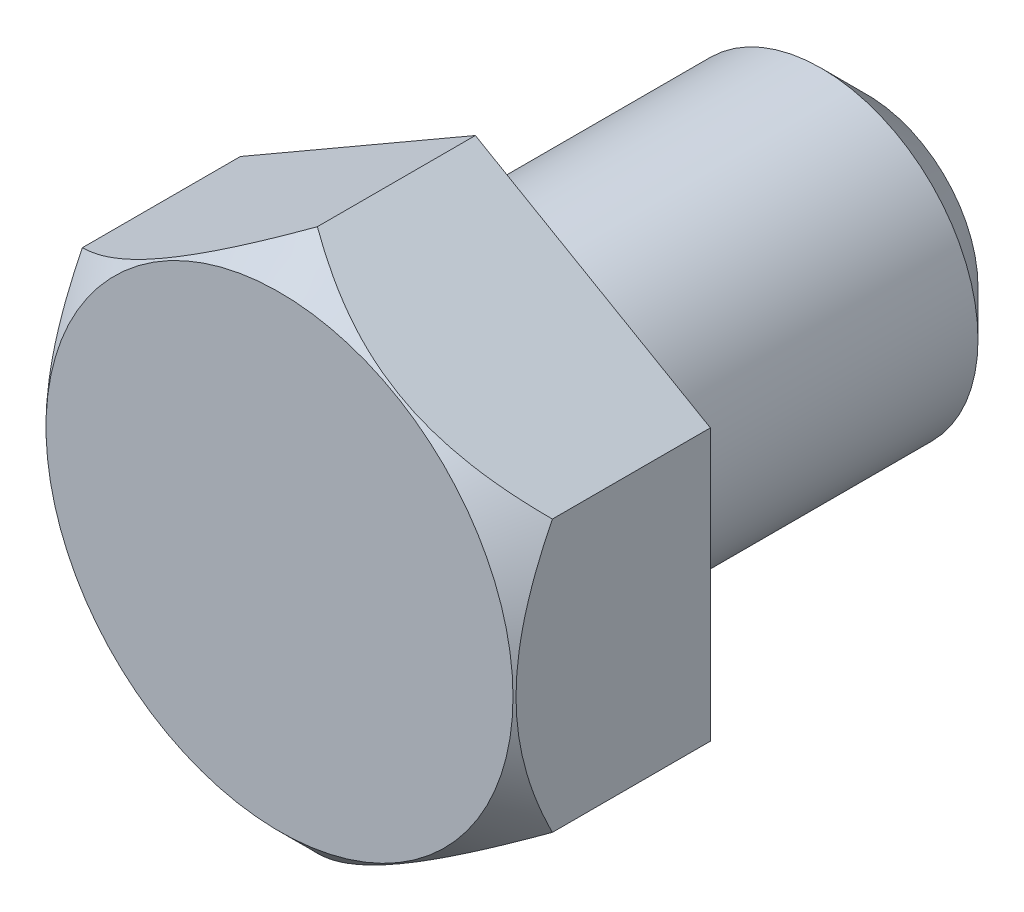
ISO-10303-21;
HEADER;
FILE_DESCRIPTION(('STEP AP214'),'2;1');
FILE_NAME('part.step','',(''),(''),'','','');
FILE_SCHEMA(('AUTOMOTIVE_DESIGN { 1 0 10303 214 1 1 1 1 }'));
ENDSEC;
DATA;
#1=APPLICATION_CONTEXT('core data for automotive mechanical design processes');
#2=APPLICATION_PROTOCOL_DEFINITION('international standard','automotive_design',2000,#1);
#3=PRODUCT_CONTEXT('',#1,'mechanical');
#4=PRODUCT('Part','Part','',(#3));
#5=PRODUCT_RELATED_PRODUCT_CATEGORY('part','',(#4));
#6=PRODUCT_DEFINITION_FORMATION('','',#4);
#7=PRODUCT_DEFINITION_CONTEXT('part definition',#1,'design');
#8=PRODUCT_DEFINITION('design','',#6,#7);
#9=PRODUCT_DEFINITION_SHAPE('','',#8);
#10=(LENGTH_UNIT() NAMED_UNIT(*) SI_UNIT(.MILLI.,.METRE.));
#11=(NAMED_UNIT(*) PLANE_ANGLE_UNIT() SI_UNIT($,.RADIAN.));
#12=(NAMED_UNIT(*) SI_UNIT($,.STERADIAN.) SOLID_ANGLE_UNIT());
#13=UNCERTAINTY_MEASURE_WITH_UNIT(LENGTH_MEASURE(1.E-05),#10,'distance_accuracy_value','');
#14=(GEOMETRIC_REPRESENTATION_CONTEXT(3) GLOBAL_UNCERTAINTY_ASSIGNED_CONTEXT((#13)) GLOBAL_UNIT_ASSIGNED_CONTEXT((#10,
#11,#12)) REPRESENTATION_CONTEXT('',''));
#15=CARTESIAN_POINT('',(0.,0.,0.));
#16=DIRECTION('',(0.,0.,1.));
#17=DIRECTION('',(1.,0.,0.));
#18=AXIS2_PLACEMENT_3D('',#15,#16,#17);
#19=CARTESIAN_POINT('',(8.99999999999999,5.19615242270663,7.5));
#20=DIRECTION('',(-0.5,-0.866025403784439,0.));
#21=DIRECTION('',(0.866025403784439,-0.5,0.));
#22=AXIS2_PLACEMENT_3D('',#19,#20,#21);
#23=PLANE('',#22);
#24=CARTESIAN_POINT('',(9.00019999999999,5.1960369526528,6.04988452802168));
#25=CARTESIAN_POINT('',(8.84546874816844,5.28537108254979,6.1392062101696));
#26=CARTESIAN_POINT('',(8.68952569814364,5.37540484445986,6.22580229696819));
#27=CARTESIAN_POINT('',(8.37502737226237,5.5569805375671,6.3926774837665));
#28=CARTESIAN_POINT('',(8.21647072612613,5.64852325989566,6.47295313382824));
#29=CARTESIAN_POINT('',(7.89580870938962,5.83365756157737,6.62666162646683));
#30=CARTESIAN_POINT('',(7.73368821770892,5.92725787109038,6.70005265649951));
#31=CARTESIAN_POINT('',(7.40678444951671,6.11599584965525,6.83839791246839));
#32=CARTESIAN_POINT('',(7.2420015844558,6.21113328115601,6.90335342829141));
#33=CARTESIAN_POINT('',(6.91242253938659,6.40141583154598,7.02277243724327));
#34=CARTESIAN_POINT('',(6.74766686150013,6.49653756652424,7.0773841146058));
#35=CARTESIAN_POINT('',(6.41584590884674,6.68811448286144,7.17625356409885));
#36=CARTESIAN_POINT('',(6.24878088478457,6.7845695194759,7.22051245093257));
#37=CARTESIAN_POINT('',(5.91305583085258,6.97840046973724,7.29756204863293));
#38=CARTESIAN_POINT('',(5.74440028444977,7.07577379485322,7.33037857345809));
#39=CARTESIAN_POINT('',(5.40567326667778,7.27133792974568,7.38382234263472));
#40=CARTESIAN_POINT('',(5.23560201074898,7.36952861513759,7.4044514084681));
#41=CARTESIAN_POINT('',(4.82115385657945,7.60881036851251,7.43904046360949));
#42=CARTESIAN_POINT('',(4.57632899956654,7.75016006561323,7.44629902346818));
#43=CARTESIAN_POINT('',(4.08712205642764,8.03260382592391,7.43411615046054));
#44=CARTESIAN_POINT('',(3.84274015556695,8.1736977821709,7.41466535847223));
#45=CARTESIAN_POINT('',(3.35628001197074,8.45455567702619,7.35021187620419));
#46=CARTESIAN_POINT('',(3.11420465353323,8.59431795038427,7.30518061323979));
#47=CARTESIAN_POINT('',(2.63421474470633,8.87144025345378,7.19201394602376));
#48=CARTESIAN_POINT('',(2.39629987672358,9.00880046652784,7.12388031347175));
#49=CARTESIAN_POINT('',(1.97396754394334,9.25263415254599,6.98371177517318));
#50=CARTESIAN_POINT('',(1.78861473287835,9.35964764790942,6.91536391886469));
#51=CARTESIAN_POINT('',(1.42123625252264,9.57175371243726,6.76765467088125));
#52=CARTESIAN_POINT('',(1.23921068413348,9.67684622334614,6.6882929458261));
#53=CARTESIAN_POINT('',(0.879060016533277,9.88477930823394,6.52033483439851));
#54=CARTESIAN_POINT('',(0.700924674637261,9.98762579582979,6.43176748990212));
#55=CARTESIAN_POINT('',(0.34795239099676,10.1914144388061,6.2465608085583));
#56=CARTESIAN_POINT('',(0.173113506341721,10.2923577159265,6.14992642107076));
#57=CARTESIAN_POINT('',(-0.000200000000003341,10.3924203154671,6.04988452802168));
#58=B_SPLINE_CURVE_WITH_KNOTS('',3,(#24,#25,#26,#27,#28,#29,#30,#31,#32,#33,#34,#35,#36,#37,#38,
#39,#40,#41,#42,#43,#44,#45,#46,#47,#48,#49,#50,#51,#52,#53,#54,#55,#56,#57),.UNSPECIFIED.,.F.,
.F.,(4,2,2,2,2,2,2,2,2,2,2,2,2,2,2,2,4),(0.,0.599280235236766,1.19888534507658,1.80192368753476,
2.40486970967003,2.99838724231363,3.59184084043245,4.18394681111483,4.77596426594383,
5.62301971612228,6.47037205551889,7.31867273053728,8.16690836485972,8.8406179995192,
9.51434803123068,10.1860136281046,10.8572701257283),.UNSPECIFIED.);
#59=CARTESIAN_POINT('',(9.,5.19615242270664,6.05));
#60=VERTEX_POINT('',#59);
#61=CARTESIAN_POINT('',(0.,10.3923048454133,6.05));
#62=VERTEX_POINT('',#61);
#63=EDGE_CURVE('E83',#60,#62,#58,.T.);
#64=ORIENTED_EDGE('',*,*,#63,.F.);
#65=DIRECTION('',(0.,0.,-1.));
#66=VECTOR('',#65,1.);
#67=CARTESIAN_POINT('',(8.99999999999999,5.19615242270663,7.5));
#68=LINE('',#67,#66);
#69=CARTESIAN_POINT('',(8.99999999999999,5.19615242270663,0.));
#70=VERTEX_POINT('',#69);
#71=EDGE_CURVE('E52',#60,#70,#68,.T.);
#72=ORIENTED_EDGE('',*,*,#71,.T.);
#73=DIRECTION('',(-0.866025403784439,0.5,0.));
#74=VECTOR('',#73,1.);
#75=CARTESIAN_POINT('',(8.99999999999999,5.19615242270663,0.));
#76=LINE('',#75,#74);
#77=CARTESIAN_POINT('',(0.,10.3923048454133,0.));
#78=VERTEX_POINT('',#77);
#79=EDGE_CURVE('E91',#70,#78,#76,.T.);
#80=ORIENTED_EDGE('',*,*,#79,.T.);
#81=DIRECTION('',(0.,0.,-1.));
#82=VECTOR('',#81,1.);
#83=CARTESIAN_POINT('',(0.,10.3923048454133,7.5));
#84=LINE('',#83,#82);
#85=EDGE_CURVE('E90',#62,#78,#84,.T.);
#86=ORIENTED_EDGE('',*,*,#85,.F.);
#87=EDGE_LOOP('',(#64,#72,#80,#86));
#88=FACE_BOUND('',#87,.T.);
#89=ADVANCED_FACE('F29',(#88),#23,.F.);
#90=CARTESIAN_POINT('',(0.,10.3923048454133,7.5));
#91=DIRECTION('',(0.5,-0.866025403784439,0.));
#92=DIRECTION('',(0.866025403784439,0.5,0.));
#93=AXIS2_PLACEMENT_3D('',#90,#91,#92);
#94=PLANE('',#93);
#95=CARTESIAN_POINT('',(0.000199999999996665,10.3924203154671,6.04988452802168));
#96=CARTESIAN_POINT('',(-0.154531251831557,10.3030861855701,6.1392062101696));
#97=CARTESIAN_POINT('',(-0.310474301856361,10.21305242366,6.22580229696819));
#98=CARTESIAN_POINT('',(-0.624972627737624,10.0314767305528,6.3926774837665));
#99=CARTESIAN_POINT('',(-0.783529273873864,9.93993400822424,6.47295313382824));
#100=CARTESIAN_POINT('',(-1.10419129061038,9.75479970654252,6.62666162646683));
#101=CARTESIAN_POINT('',(-1.26631178229108,9.66119939702951,6.7000526564995));
#102=CARTESIAN_POINT('',(-1.59321555048329,9.47246141846464,6.83839791246839));
#103=CARTESIAN_POINT('',(-1.7579984155442,9.37732398696389,6.90335342829141));
#104=CARTESIAN_POINT('',(-2.08757746061341,9.18704143657392,7.02277243724327));
#105=CARTESIAN_POINT('',(-2.25233313849987,9.09191970159565,7.0773841146058));
#106=CARTESIAN_POINT('',(-2.58415409115326,8.90034278525845,7.17625356409885));
#107=CARTESIAN_POINT('',(-2.75121911521543,8.80388774864399,7.22051245093256));
#108=CARTESIAN_POINT('',(-3.08694416914742,8.61005679838265,7.29756204863293));
#109=CARTESIAN_POINT('',(-3.25559971555023,8.51268347326667,7.33037857345809));
#110=CARTESIAN_POINT('',(-3.59432673332222,8.31711933837421,7.38382234263472));
#111=CARTESIAN_POINT('',(-3.76439798925102,8.2189286529823,7.4044514084681));
#112=CARTESIAN_POINT('',(-4.17884614342055,7.97964689960738,7.43904046360949));
#113=CARTESIAN_POINT('',(-4.42367100043347,7.83829720250666,7.44629902346818));
#114=CARTESIAN_POINT('',(-4.91287794357236,7.55585344219598,7.43411615046054));
#115=CARTESIAN_POINT('',(-5.15725984443305,7.41475948594899,7.41466535847223));
#116=CARTESIAN_POINT('',(-5.64371998802927,7.1339015910937,7.35021187620419));
#117=CARTESIAN_POINT('',(-5.88579534646678,6.99413931773562,7.30518061323979));
#118=CARTESIAN_POINT('',(-6.36578525529367,6.71701701466611,7.19201394602375));
#119=CARTESIAN_POINT('',(-6.60370012327643,6.57965680159205,7.12388031347175));
#120=CARTESIAN_POINT('',(-7.02603245605666,6.3358231155739,6.98371177517318));
#121=CARTESIAN_POINT('',(-7.21138526712166,6.22880962021047,6.91536391886469));
#122=CARTESIAN_POINT('',(-7.57876374747736,6.01670355568263,6.76765467088124));
#123=CARTESIAN_POINT('',(-7.76078931586653,5.91161104477375,6.6882929458261));
#124=CARTESIAN_POINT('',(-8.12093998346672,5.70367795988596,6.5203348343985));
#125=CARTESIAN_POINT('',(-8.29907532536274,5.60083147229011,6.43176748990212));
#126=CARTESIAN_POINT('',(-8.65204760900324,5.39704282931379,6.24656080855829));
#127=CARTESIAN_POINT('',(-8.82688649365828,5.29609955219339,6.14992642107076));
#128=CARTESIAN_POINT('',(-9.0002,5.19603695265279,6.04988452802168));
#129=B_SPLINE_CURVE_WITH_KNOTS('',3,(#95,#96,#97,#98,#99,#100,#101,#102,#103,#104,#105,#106,
#107,#108,#109,#110,#111,#112,#113,#114,#115,#116,#117,#118,#119,#120,#121,#122,#123,#124,#125,
#126,#127,#128),.UNSPECIFIED.,.F.,.F.,(4,2,2,2,2,2,2,2,2,2,2,2,2,2,2,2,4),(0.,0.599280235236767,
1.19888534507658,1.80192368753476,2.40486970967003,2.99838724231364,3.59184084043245,
4.18394681111483,4.77596426594383,5.62301971612229,6.47037205551889,7.31867273053728,
8.16690836485972,8.84061799951921,9.51434803123069,10.1860136281046,10.8572701257283),.UNSPECIFIED.);
#130=CARTESIAN_POINT('',(-9.,5.19615242270663,6.05));
#131=VERTEX_POINT('',#130);
#132=EDGE_CURVE('E92',#62,#131,#129,.T.);
#133=ORIENTED_EDGE('',*,*,#132,.F.);
#134=ORIENTED_EDGE('',*,*,#85,.T.);
#135=DIRECTION('',(-0.866025403784439,-0.5,0.));
#136=VECTOR('',#135,1.);
#137=CARTESIAN_POINT('',(0.,10.3923048454133,0.));
#138=LINE('',#137,#136);
#139=CARTESIAN_POINT('',(-9.,5.19615242270663,0.));
#140=VERTEX_POINT('',#139);
#141=EDGE_CURVE('E251',#78,#140,#138,.T.);
#142=ORIENTED_EDGE('',*,*,#141,.T.);
#143=DIRECTION('',(0.,0.,-1.));
#144=VECTOR('',#143,1.);
#145=CARTESIAN_POINT('',(-9.,5.19615242270663,7.5));
#146=LINE('',#145,#144);
#147=EDGE_CURVE('E109',#131,#140,#146,.T.);
#148=ORIENTED_EDGE('',*,*,#147,.F.);
#149=EDGE_LOOP('',(#133,#134,#142,#148));
#150=FACE_BOUND('',#149,.T.);
#151=ADVANCED_FACE('F133',(#150),#94,.F.);
#152=CARTESIAN_POINT('',(-9.,5.19615242270663,7.5));
#153=DIRECTION('',(1.,0.,0.));
#154=DIRECTION('',(0.,1.,0.));
#155=AXIS2_PLACEMENT_3D('',#152,#153,#154);
#156=PLANE('',#155);
#157=CARTESIAN_POINT('',(-9.,-10.8206656543603,2.36797341534342));
#158=CARTESIAN_POINT('',(-9.,-10.5591534710426,2.56898474466377));
#159=CARTESIAN_POINT('',(-9.,-10.2962295695414,2.76818836388469));
#160=CARTESIAN_POINT('',(-9.,-9.7669822628075,3.16215508197963));
#161=CARTESIAN_POINT('',(-9.,-9.50065806581457,3.35691711608966));
#162=CARTESIAN_POINT('',(-9.,-8.9620876195428,3.74256164209066));
#163=CARTESIAN_POINT('',(-9.,-8.68981152995522,3.93340259709294));
#164=CARTESIAN_POINT('',(-9.,-8.1407233432396,4.30842104769678));
#165=CARTESIAN_POINT('',(-9.,-7.86391156070987,4.49259900262918));
#166=CARTESIAN_POINT('',(-9.,-7.28735573629986,4.86413966383312));
#167=CARTESIAN_POINT('',(-9.,-6.98726686055188,5.05096994440507));
#168=CARTESIAN_POINT('',(-9.,-6.38004353426591,5.41300221801002));
#169=CARTESIAN_POINT('',(-9.,-6.07290791290248,5.58820225955952));
#170=CARTESIAN_POINT('',(-9.,-5.45151243654742,5.92324051978842));
#171=CARTESIAN_POINT('',(-9.,-5.13727709054008,6.08312383977347));
#172=CARTESIAN_POINT('',(-9.,-4.49993772744527,6.38394659183207));
#173=CARTESIAN_POINT('',(-9.,-4.17683797323645,6.52489494386541));
#174=CARTESIAN_POINT('',(-9.,-3.55315889495205,6.77012650715317));
#175=CARTESIAN_POINT('',(-9.,-3.25346858122324,6.87664766899407));
#176=CARTESIAN_POINT('',(-9.,-2.6464726253964,7.06569958635688));
#177=CARTESIAN_POINT('',(-9.,-2.3391664978883,7.14822880841162));
#178=CARTESIAN_POINT('',(-9.,-1.72411454919937,7.28346199865793));
#179=CARTESIAN_POINT('',(-9.,-1.41648953083334,7.33670617022749));
#180=CARTESIAN_POINT('',(-9.,-0.79744290002866,7.41226190656771));
#181=CARTESIAN_POINT('',(-9.,-0.486022081625765,7.43457983239523));
#182=CARTESIAN_POINT('',(-9.,0.123944713404887,7.44639353800857));
#183=CARTESIAN_POINT('',(-9.,0.42246423905943,7.43726878667557));
#184=CARTESIAN_POINT('',(-9.,1.01716333454385,7.38986246610543));
#185=CARTESIAN_POINT('',(-9.,1.31334268857592,7.35157823892694));
#186=CARTESIAN_POINT('',(-9.,1.90623664847018,7.24736327720784));
#187=CARTESIAN_POINT('',(-9.,2.20286415027568,7.18094530028799));
#188=CARTESIAN_POINT('',(-9.,2.78959060648163,7.02414072277436));
#189=CARTESIAN_POINT('',(-9.,3.07968993932876,6.93375551549637));
#190=CARTESIAN_POINT('',(-9.,3.66979925953434,6.72703186627928));
#191=CARTESIAN_POINT('',(-9.,3.9693765062085,6.60947204277634));
#192=CARTESIAN_POINT('',(-9.,4.56082238260966,6.35619457779586));
#193=CARTESIAN_POINT('',(-9.,4.85268745988634,6.22046873727902));
#194=CARTESIAN_POINT('',(-9.,5.43008930597691,5.93407830599356));
#195=CARTESIAN_POINT('',(-9.,5.71560304653794,5.7833676637493));
#196=CARTESIAN_POINT('',(-9.,6.28008700978101,5.47032480378405));
#197=CARTESIAN_POINT('',(-9.,6.55905823258745,5.30799437790296));
#198=CARTESIAN_POINT('',(-9.,7.09767494879576,4.98223014221199));
#199=CARTESIAN_POINT('',(-9.,7.35759439092468,4.81924688452906));
#200=CARTESIAN_POINT('',(-9.,7.87296777358696,4.48634620591854));
#201=CARTESIAN_POINT('',(-9.,8.12842137710196,4.31642826485808));
#202=CARTESIAN_POINT('',(-9.,8.6333927523989,3.9722790900151));
#203=CARTESIAN_POINT('',(-9.,8.88294172234709,3.7980934688641));
#204=CARTESIAN_POINT('',(-9.,9.37861668026239,3.44505536137082));
#205=CARTESIAN_POINT('',(-9.,9.62474359280476,3.26620417467312));
#206=CARTESIAN_POINT('',(-9.,9.8694351057001,3.08544333884572));
#207=B_SPLINE_CURVE_WITH_KNOTS('',3,(#157,#158,#159,#160,#161,#162,#163,#164,#165,#166,#167,
#168,#169,#170,#171,#172,#173,#174,#175,#176,#177,#178,#179,#180,#181,#182,#183,#184,#185,#186,
#187,#188,#189,#190,#191,#192,#193,#194,#195,#196,#197,#198,#199,#200,#201,#202,#203,#204,#205,
#206),.UNSPECIFIED.,.F.,.F.,(4,2,2,2,2,2,2,2,2,2,2,2,2,2,2,2,2,2,2,2,2,2,2,2,4),(0.,
0.989537088057374,1.97930895205032,2.97671888198217,3.97405992139084,5.03433610005736,
6.09478973926846,7.15201807932918,8.20874661640774,9.16209824831975,10.115510801199,
11.0506899914377,11.9856768010206,12.8801752427891,13.7747552295407,14.6855060926938,
15.5962040216756,16.5609179021838,17.5260686736697,18.4942830546041,19.4623484514246,
20.3825970494356,21.3029147975965,22.2158397246058,23.1285130061524),.UNSPECIFIED.);
#208=CARTESIAN_POINT('',(-8.99999999999999,-5.19615242270663,6.05));
#209=VERTEX_POINT('',#208);
#210=EDGE_CURVE('E154',#131,#209,#207,.F.);
#211=ORIENTED_EDGE('',*,*,#210,.F.);
#212=ORIENTED_EDGE('',*,*,#147,.T.);
#213=DIRECTION('',(0.,-1.,0.));
#214=VECTOR('',#213,1.);
#215=CARTESIAN_POINT('',(-9.,5.19615242270663,0.));
#216=LINE('',#215,#214);
#217=CARTESIAN_POINT('',(-9.,-5.19615242270663,0.));
#218=VERTEX_POINT('',#217);
#219=EDGE_CURVE('E252',#140,#218,#216,.T.);
#220=ORIENTED_EDGE('',*,*,#219,.T.);
#221=DIRECTION('',(0.,0.,-1.));
#222=VECTOR('',#221,1.);
#223=CARTESIAN_POINT('',(-9.,-5.19615242270663,7.5));
#224=LINE('',#223,#222);
#225=EDGE_CURVE('E107',#209,#218,#224,.T.);
#226=ORIENTED_EDGE('',*,*,#225,.F.);
#227=EDGE_LOOP('',(#211,#212,#220,#226));
#228=FACE_BOUND('',#227,.T.);
#229=ADVANCED_FACE('F138',(#228),#156,.F.);
#230=CARTESIAN_POINT('',(-9.,-5.19615242270663,7.5));
#231=DIRECTION('',(0.5,0.866025403784439,0.));
#232=DIRECTION('',(-0.866025403784439,0.5,0.));
#233=AXIS2_PLACEMENT_3D('',#230,#231,#232);
#234=PLANE('',#233);
#235=CARTESIAN_POINT('',(-9.0002,-5.1960369526528,6.04988452802168));
#236=CARTESIAN_POINT('',(-8.84546874816844,-5.28537108254979,6.13920621016959));
#237=CARTESIAN_POINT('',(-8.68952569814364,-5.37540484445986,6.22580229696819));
#238=CARTESIAN_POINT('',(-8.37502737226237,-5.5569805375671,6.3926774837665));
#239=CARTESIAN_POINT('',(-8.21647072612614,-5.64852325989566,6.47295313382824));
#240=CARTESIAN_POINT('',(-7.89580870938962,-5.83365756157738,6.62666162646683));
#241=CARTESIAN_POINT('',(-7.73368821770892,-5.92725787109038,6.7000526564995));
#242=CARTESIAN_POINT('',(-7.40678444951671,-6.11599584965526,6.83839791246839));
#243=CARTESIAN_POINT('',(-7.2420015844558,-6.21113328115601,6.90335342829141));
#244=CARTESIAN_POINT('',(-6.91242253938659,-6.40141583154598,7.02277243724327));
#245=CARTESIAN_POINT('',(-6.74766686150013,-6.49653756652425,7.0773841146058));
#246=CARTESIAN_POINT('',(-6.41584590884673,-6.68811448286144,7.17625356409885));
#247=CARTESIAN_POINT('',(-6.24878088478457,-6.78456951947591,7.22051245093257));
#248=CARTESIAN_POINT('',(-5.91305583085258,-6.97840046973724,7.29756204863293));
#249=CARTESIAN_POINT('',(-5.74440028444977,-7.07577379485323,7.33037857345809));
#250=CARTESIAN_POINT('',(-5.40567326667778,-7.27133792974569,7.38382234263472));
#251=CARTESIAN_POINT('',(-5.23560201074898,-7.36952861513759,7.4044514084681));
#252=CARTESIAN_POINT('',(-4.82115385657945,-7.60881036851252,7.43904046360949));
#253=CARTESIAN_POINT('',(-4.57632899956654,-7.75016006561323,7.44629902346818));
#254=CARTESIAN_POINT('',(-4.08712205642764,-8.03260382592391,7.43411615046054));
#255=CARTESIAN_POINT('',(-3.84274015556695,-8.1736977821709,7.41466535847223));
#256=CARTESIAN_POINT('',(-3.35628001197074,-8.4545556770262,7.35021187620419));
#257=CARTESIAN_POINT('',(-3.11420465353323,-8.59431795038427,7.30518061323979));
#258=CARTESIAN_POINT('',(-2.63421474470633,-8.87144025345378,7.19201394602376));
#259=CARTESIAN_POINT('',(-2.39629987672357,-9.00880046652784,7.12388031347175));
#260=CARTESIAN_POINT('',(-1.97396754394334,-9.25263415254599,6.98371177517318));
#261=CARTESIAN_POINT('',(-1.78861473287834,-9.35964764790942,6.91536391886469));
#262=CARTESIAN_POINT('',(-1.42123625252264,-9.57175371243726,6.76765467088124));
#263=CARTESIAN_POINT('',(-1.23921068413347,-9.67684622334614,6.6882929458261));
#264=CARTESIAN_POINT('',(-0.879060016533275,-9.88477930823394,6.5203348343985));
#265=CARTESIAN_POINT('',(-0.70092467463726,-9.98762579582979,6.43176748990212));
#266=CARTESIAN_POINT('',(-0.34795239099676,-10.1914144388061,6.24656080855829));
#267=CARTESIAN_POINT('',(-0.173113506341723,-10.2923577159265,6.14992642107076));
#268=CARTESIAN_POINT('',(0.000200000000002587,-10.3924203154671,6.04988452802168));
#269=B_SPLINE_CURVE_WITH_KNOTS('',3,(#235,#236,#237,#238,#239,#240,#241,#242,#243,#244,#245,
#246,#247,#248,#249,#250,#251,#252,#253,#254,#255,#256,#257,#258,#259,#260,#261,#262,#263,#264,
#265,#266,#267,#268),.UNSPECIFIED.,.F.,.F.,(4,2,2,2,2,2,2,2,2,2,2,2,2,2,2,2,4),(0.,
0.599280235236769,1.19888534507659,1.80192368753476,2.40486970967003,2.99838724231364,
3.59184084043245,4.18394681111483,4.77596426594383,5.62301971612229,6.47037205551889,
7.31867273053728,8.16690836485972,8.84061799951921,9.51434803123069,10.1860136281046,
10.8572701257283),.UNSPECIFIED.);
#270=CARTESIAN_POINT('',(0.,-10.3923048454133,6.05));
#271=VERTEX_POINT('',#270);
#272=EDGE_CURVE('E183',#209,#271,#269,.T.);
#273=ORIENTED_EDGE('',*,*,#272,.F.);
#274=ORIENTED_EDGE('',*,*,#225,.T.);
#275=DIRECTION('',(0.866025403784439,-0.5,0.));
#276=VECTOR('',#275,1.);
#277=CARTESIAN_POINT('',(-9.,-5.19615242270663,0.));
#278=LINE('',#277,#276);
#279=CARTESIAN_POINT('',(0.,-10.3923048454133,0.));
#280=VERTEX_POINT('',#279);
#281=EDGE_CURVE('E257',#218,#280,#278,.T.);
#282=ORIENTED_EDGE('',*,*,#281,.T.);
#283=DIRECTION('',(0.,0.,-1.));
#284=VECTOR('',#283,1.);
#285=CARTESIAN_POINT('',(0.,-10.3923048454133,7.5));
#286=LINE('',#285,#284);
#287=EDGE_CURVE('E100',#271,#280,#286,.T.);
#288=ORIENTED_EDGE('',*,*,#287,.F.);
#289=EDGE_LOOP('',(#273,#274,#282,#288));
#290=FACE_BOUND('',#289,.T.);
#291=ADVANCED_FACE('F143',(#290),#234,.F.);
#292=CARTESIAN_POINT('',(0.,-10.3923048454133,7.5));
#293=DIRECTION('',(-0.5,0.866025403784439,0.));
#294=DIRECTION('',(-0.866025403784439,-0.5,0.));
#295=AXIS2_PLACEMENT_3D('',#292,#293,#294);
#296=PLANE('',#295);
#297=CARTESIAN_POINT('',(-0.000199999999998163,-10.3924203154671,6.04988452802168));
#298=CARTESIAN_POINT('',(0.154531251831556,-10.3030861855701,6.13920621016959));
#299=CARTESIAN_POINT('',(0.31047430185636,-10.21305242366,6.22580229696819));
#300=CARTESIAN_POINT('',(0.624972627737622,-10.0314767305528,6.3926774837665));
#301=CARTESIAN_POINT('',(0.783529273873862,-9.93993400822424,6.47295313382824));
#302=CARTESIAN_POINT('',(1.10419129061038,-9.75479970654252,6.62666162646683));
#303=CARTESIAN_POINT('',(1.26631178229108,-9.66119939702951,6.7000526564995));
#304=CARTESIAN_POINT('',(1.59321555048329,-9.47246141846464,6.83839791246838));
#305=CARTESIAN_POINT('',(1.7579984155442,-9.37732398696389,6.90335342829141));
#306=CARTESIAN_POINT('',(2.08757746061341,-9.18704143657392,7.02277243724326));
#307=CARTESIAN_POINT('',(2.25233313849987,-9.09191970159565,7.0773841146058));
#308=CARTESIAN_POINT('',(2.58415409115326,-8.90034278525845,7.17625356409885));
#309=CARTESIAN_POINT('',(2.75121911521543,-8.80388774864399,7.22051245093256));
#310=CARTESIAN_POINT('',(3.08694416914742,-8.61005679838265,7.29756204863292));
#311=CARTESIAN_POINT('',(3.25559971555023,-8.51268347326667,7.33037857345809));
#312=CARTESIAN_POINT('',(3.59432673332222,-8.31711933837421,7.38382234263472));
#313=CARTESIAN_POINT('',(3.76439798925102,-8.2189286529823,7.4044514084681));
#314=CARTESIAN_POINT('',(4.17884614342055,-7.97964689960738,7.43904046360949));
#315=CARTESIAN_POINT('',(4.42367100043346,-7.83829720250666,7.44629902346818));
#316=CARTESIAN_POINT('',(4.91287794357236,-7.55585344219599,7.43411615046054));
#317=CARTESIAN_POINT('',(5.15725984443305,-7.414759485949,7.41466535847223));
#318=CARTESIAN_POINT('',(5.64371998802926,-7.1339015910937,7.35021187620419));
#319=CARTESIAN_POINT('',(5.88579534646678,-6.99413931773563,7.30518061323979));
#320=CARTESIAN_POINT('',(6.36578525529367,-6.71701701466611,7.19201394602376));
#321=CARTESIAN_POINT('',(6.60370012327643,-6.57965680159205,7.12388031347175));
#322=CARTESIAN_POINT('',(7.02603245605666,-6.3358231155739,6.98371177517318));
#323=CARTESIAN_POINT('',(7.21138526712166,-6.22880962021047,6.91536391886469));
#324=CARTESIAN_POINT('',(7.57876374747736,-6.01670355568263,6.76765467088124));
#325=CARTESIAN_POINT('',(7.76078931586653,-5.91161104477375,6.6882929458261));
#326=CARTESIAN_POINT('',(8.12093998346672,-5.70367795988596,6.5203348343985));
#327=CARTESIAN_POINT('',(8.29907532536274,-5.6008314722901,6.43176748990212));
#328=CARTESIAN_POINT('',(8.65204760900324,-5.39704282931379,6.24656080855829));
#329=CARTESIAN_POINT('',(8.82688649365828,-5.29609955219339,6.14992642107076));
#330=CARTESIAN_POINT('',(9.0002,-5.19603695265279,6.04988452802168));
#331=B_SPLINE_CURVE_WITH_KNOTS('',3,(#297,#298,#299,#300,#301,#302,#303,#304,#305,#306,#307,
#308,#309,#310,#311,#312,#313,#314,#315,#316,#317,#318,#319,#320,#321,#322,#323,#324,#325,#326,
#327,#328,#329,#330),.UNSPECIFIED.,.F.,.F.,(4,2,2,2,2,2,2,2,2,2,2,2,2,2,2,2,4),(0.,
0.599280235236768,1.19888534507658,1.80192368753476,2.40486970967003,2.99838724231364,
3.59184084043245,4.18394681111483,4.77596426594384,5.62301971612229,6.47037205551889,
7.31867273053728,8.16690836485972,8.84061799951921,9.51434803123069,10.1860136281046,
10.8572701257283),.UNSPECIFIED.);
#332=CARTESIAN_POINT('',(9.,-5.19615242270663,6.05));
#333=VERTEX_POINT('',#332);
#334=EDGE_CURVE('E44',#271,#333,#331,.T.);
#335=ORIENTED_EDGE('',*,*,#334,.F.);
#336=ORIENTED_EDGE('',*,*,#287,.T.);
#337=DIRECTION('',(0.866025403784439,0.5,0.));
#338=VECTOR('',#337,1.);
#339=CARTESIAN_POINT('',(0.,-10.3923048454133,0.));
#340=LINE('',#339,#338);
#341=CARTESIAN_POINT('',(9.,-5.19615242270663,0.));
#342=VERTEX_POINT('',#341);
#343=EDGE_CURVE('E102',#280,#342,#340,.T.);
#344=ORIENTED_EDGE('',*,*,#343,.T.);
#345=DIRECTION('',(0.,0.,-1.));
#346=VECTOR('',#345,1.);
#347=CARTESIAN_POINT('',(9.,-5.19615242270663,7.5));
#348=LINE('',#347,#346);
#349=EDGE_CURVE('E98',#333,#342,#348,.T.);
#350=ORIENTED_EDGE('',*,*,#349,.F.);
#351=EDGE_LOOP('',(#335,#336,#344,#350));
#352=FACE_BOUND('',#351,.T.);
#353=ADVANCED_FACE('F189',(#352),#296,.F.);
#354=CARTESIAN_POINT('',(9.,-5.19615242270663,7.5));
#355=DIRECTION('',(-1.,0.,0.));
#356=DIRECTION('',(0.,-1.,0.));
#357=AXIS2_PLACEMENT_3D('',#354,#355,#356);
#358=PLANE('',#357);
#359=CARTESIAN_POINT('',(9.,-10.8206656543629,2.36797341534139));
#360=CARTESIAN_POINT('',(9.,-10.5591534710451,2.56898474466182));
#361=CARTESIAN_POINT('',(9.,-10.2962295695438,2.76818836388282));
#362=CARTESIAN_POINT('',(9.,-9.76698226280982,3.16215508197792));
#363=CARTESIAN_POINT('',(9.,-9.50065806581682,3.35691711608802));
#364=CARTESIAN_POINT('',(9.,-8.96208761954489,3.74256164208918));
#365=CARTESIAN_POINT('',(9.,-8.68981152995723,3.93340259709154));
#366=CARTESIAN_POINT('',(9.,-8.14072334324145,4.30842104769554));
#367=CARTESIAN_POINT('',(9.,-7.86391156071164,4.49259900262801));
#368=CARTESIAN_POINT('',(9.,-7.28735573630145,4.86413966383211));
#369=CARTESIAN_POINT('',(9.,-6.98726686055338,5.05096994440415));
#370=CARTESIAN_POINT('',(9.,-6.38004353426722,5.41300221800926));
#371=CARTESIAN_POINT('',(9.,-6.07290791290369,5.58820225955885));
#372=CARTESIAN_POINT('',(9.,-5.45151243654844,5.9232405197879));
#373=CARTESIAN_POINT('',(9.,-5.13727709054099,6.08312383977302));
#374=CARTESIAN_POINT('',(9.,-4.49993772744598,6.38394659183176));
#375=CARTESIAN_POINT('',(9.,-4.17683797323706,6.52489494386515));
#376=CARTESIAN_POINT('',(9.,-3.55315889495261,6.77012650715296));
#377=CARTESIAN_POINT('',(9.,-3.25346858122386,6.87664766899385));
#378=CARTESIAN_POINT('',(9.,-2.64647262539716,7.06569958635667));
#379=CARTESIAN_POINT('',(9.,-2.33916649788913,7.14822880841141));
#380=CARTESIAN_POINT('',(9.,-1.72411454920034,7.28346199865775));
#381=CARTESIAN_POINT('',(9.,-1.41648953083437,7.33670617022733));
#382=CARTESIAN_POINT('',(9.,-0.797442900029822,7.4122619065676));
#383=CARTESIAN_POINT('',(9.,-0.486022081626992,7.43457983239516));
#384=CARTESIAN_POINT('',(9.,0.123944713403551,7.44639353800859));
#385=CARTESIAN_POINT('',(9.,0.422464239058049,7.43726878667564));
#386=CARTESIAN_POINT('',(9.,1.01716333454239,7.3898624661056));
#387=CARTESIAN_POINT('',(9.,1.31334268857441,7.35157823892716));
#388=CARTESIAN_POINT('',(9.,1.90623664846859,7.24736327720817));
#389=CARTESIAN_POINT('',(9.,2.20286415027405,7.18094530028839));
#390=CARTESIAN_POINT('',(9.,2.78959060647992,7.02414072277487));
#391=CARTESIAN_POINT('',(9.,3.07968993932702,6.93375551549694));
#392=CARTESIAN_POINT('',(9.,3.66979925953239,6.72703186628002));
#393=CARTESIAN_POINT('',(8.99999999999999,3.96937650620639,6.6094720427772));
#394=CARTESIAN_POINT('',(8.99999999999999,4.56082238260723,6.35619457779696));
#395=CARTESIAN_POINT('',(8.99999999999999,4.85268745988375,6.22046873728025));
#396=CARTESIAN_POINT('',(8.99999999999999,5.43008930597401,5.93407830599506));
#397=CARTESIAN_POINT('',(8.99999999999999,5.71560304653489,5.78336766375094));
#398=CARTESIAN_POINT('',(8.99999999999999,6.28008700977766,5.47032480378597));
#399=CARTESIAN_POINT('',(8.99999999999999,6.55905823258396,5.30799437790502));
#400=CARTESIAN_POINT('',(8.99999999999999,7.097674948792,4.98223014221432));
#401=CARTESIAN_POINT('',(8.99999999999999,7.35759439092081,4.81924688453152));
#402=CARTESIAN_POINT('',(8.99999999999999,7.87296777358286,4.48634620592125));
#403=CARTESIAN_POINT('',(8.99999999999999,8.12842137709773,4.31642826486092));
#404=CARTESIAN_POINT('',(8.99999999999999,8.63339275239445,3.97227909001819));
#405=CARTESIAN_POINT('',(8.99999999999999,8.88294172234252,3.79809346886731));
#406=CARTESIAN_POINT('',(8.99999999999999,9.37861668025759,3.44505536137429));
#407=CARTESIAN_POINT('',(8.99999999999999,9.62474359279985,3.26620417467671));
#408=CARTESIAN_POINT('',(8.99999999999999,9.86943510569508,3.08544333884944));
#409=B_SPLINE_CURVE_WITH_KNOTS('',3,(#359,#360,#361,#362,#363,#364,#365,#366,#367,#368,#369,
#370,#371,#372,#373,#374,#375,#376,#377,#378,#379,#380,#381,#382,#383,#384,#385,#386,#387,#388,
#389,#390,#391,#392,#393,#394,#395,#396,#397,#398,#399,#400,#401,#402,#403,#404,#405,#406,#407,
#408),.UNSPECIFIED.,.F.,.F.,(4,2,2,2,2,2,2,2,2,2,2,2,2,2,2,2,2,2,2,2,2,2,2,2,4),(0.,
0.989537088057701,1.97930895205097,2.97671888198315,3.97405992139215,5.03433610005904,
6.09478973927051,7.1520180793316,8.20874661641052,9.16209824832234,10.1155108012014,
11.0506899914399,11.9856768010226,12.8801752427909,13.7747552295424,14.6855060926954,
15.596204021677,16.5609179021846,17.52606867367,18.4942830546038,19.4623484514237,
20.3825970494342,21.3029147975946,22.2158397246034,23.1285130061494),.UNSPECIFIED.);
#410=EDGE_CURVE('E81',#333,#60,#409,.T.);
#411=ORIENTED_EDGE('',*,*,#410,.F.);
#412=ORIENTED_EDGE('',*,*,#349,.T.);
#413=DIRECTION('',(0.,1.,0.));
#414=VECTOR('',#413,1.);
#415=CARTESIAN_POINT('',(9.,-5.19615242270663,0.));
#416=LINE('',#415,#414);
#417=EDGE_CURVE('E96',#342,#70,#416,.T.);
#418=ORIENTED_EDGE('',*,*,#417,.T.);
#419=ORIENTED_EDGE('',*,*,#71,.F.);
#420=EDGE_LOOP('',(#411,#412,#418,#419));
#421=FACE_BOUND('',#420,.T.);
#422=ADVANCED_FACE('F94',(#421),#358,.F.);
#423=CARTESIAN_POINT('',(-9.00000000000001,15.5884572681199,0.));
#424=DIRECTION('',(0.,0.,1.));
#425=DIRECTION('',(1.,0.,0.));
#426=AXIS2_PLACEMENT_3D('',#423,#424,#425);
#427=PLANE('',#426);
#428=ORIENTED_EDGE('',*,*,#79,.F.);
#429=ORIENTED_EDGE('',*,*,#417,.F.);
#430=ORIENTED_EDGE('',*,*,#343,.F.);
#431=ORIENTED_EDGE('',*,*,#281,.F.);
#432=ORIENTED_EDGE('',*,*,#219,.F.);
#433=ORIENTED_EDGE('',*,*,#141,.F.);
#434=EDGE_LOOP('',(#428,#429,#430,#431,#432,#433));
#435=FACE_BOUND('',#434,.T.);
#436=CARTESIAN_POINT('',(0.,0.,0.));
#437=DIRECTION('',(0.,0.,1.));
#438=DIRECTION('',(1.,0.,0.));
#439=AXIS2_PLACEMENT_3D('',#436,#437,#438);
#440=CIRCLE('',#439,6.);
#441=CARTESIAN_POINT('',(6.,0.,0.));
#442=VERTEX_POINT('',#441);
#443=EDGE_CURVE('E112',#442,#442,#440,.F.);
#444=ORIENTED_EDGE('',*,*,#443,.F.);
#445=EDGE_LOOP('',(#444));
#446=FACE_BOUND('',#445,.T.);
#447=ADVANCED_FACE('F196',(#435,#446),#427,.F.);
#448=CARTESIAN_POINT('',(0.,0.,-15.));
#449=DIRECTION('',(0.,0.,1.));
#450=DIRECTION('',(1.,0.,0.));
#451=AXIS2_PLACEMENT_3D('',#448,#449,#450);
#452=CYLINDRICAL_SURFACE('',#451,6.);
#453=CARTESIAN_POINT('',(0.,0.,-13.25));
#454=DIRECTION('',(0.,0.,-1.));
#455=DIRECTION('',(-1.,0.,0.));
#456=AXIS2_PLACEMENT_3D('',#453,#454,#455);
#457=CIRCLE('',#456,6.);
#458=CARTESIAN_POINT('',(6.,0.,-13.25));
#459=VERTEX_POINT('',#458);
#460=EDGE_CURVE('E11',#459,#459,#457,.F.);
#461=ORIENTED_EDGE('',*,*,#460,.T.);
#462=EDGE_LOOP('',(#461));
#463=FACE_BOUND('',#462,.T.);
#464=ORIENTED_EDGE('',*,*,#443,.T.);
#465=EDGE_LOOP('',(#464));
#466=FACE_BOUND('',#465,.T.);
#467=ADVANCED_FACE('F198',(#463,#466),#452,.T.);
#468=CARTESIAN_POINT('',(0.,0.,-15.));
#469=DIRECTION('',(0.,0.,-1.));
#470=DIRECTION('',(-1.,0.,0.));
#471=AXIS2_PLACEMENT_3D('',#468,#469,#470);
#472=PLANE('',#471);
#473=CARTESIAN_POINT('',(0.,0.,-15.));
#474=DIRECTION('',(0.,0.,-1.));
#475=DIRECTION('',(-1.,0.,0.));
#476=AXIS2_PLACEMENT_3D('',#473,#474,#475);
#477=CIRCLE('',#476,4.25);
#478=CARTESIAN_POINT('',(4.25,0.,-15.));
#479=VERTEX_POINT('',#478);
#480=EDGE_CURVE('E37',#479,#479,#477,.T.);
#481=ORIENTED_EDGE('',*,*,#480,.T.);
#482=EDGE_LOOP('',(#481));
#483=FACE_BOUND('',#482,.T.);
#484=ADVANCED_FACE('F117',(#483),#472,.T.);
#485=CARTESIAN_POINT('',(0.,0.,7.5));
#486=DIRECTION('',(0.,0.,-1.));
#487=DIRECTION('',(-1.,0.,0.));
#488=AXIS2_PLACEMENT_3D('',#485,#486,#487);
#489=CONICAL_SURFACE('',#488,8.94230484541326,0.785398163397448);
#490=CARTESIAN_POINT('',(0.,0.,7.5));
#491=DIRECTION('',(0.,0.,1.));
#492=DIRECTION('',(1.,0.,0.));
#493=AXIS2_PLACEMENT_3D('',#490,#491,#492);
#494=CIRCLE('',#493,8.94230484541326);
#495=CARTESIAN_POINT('',(8.94230484541326,0.,7.5));
#496=VERTEX_POINT('',#495);
#497=EDGE_CURVE('E87',#496,#496,#494,.T.);
#498=ORIENTED_EDGE('',*,*,#497,.F.);
#499=EDGE_LOOP('',(#498));
#500=FACE_BOUND('',#499,.T.);
#501=ORIENTED_EDGE('',*,*,#63,.T.);
#502=ORIENTED_EDGE('',*,*,#132,.T.);
#503=ORIENTED_EDGE('',*,*,#210,.T.);
#504=ORIENTED_EDGE('',*,*,#272,.T.);
#505=ORIENTED_EDGE('',*,*,#334,.T.);
#506=ORIENTED_EDGE('',*,*,#410,.T.);
#507=EDGE_LOOP('',(#501,#502,#503,#504,#505,#506));
#508=FACE_BOUND('',#507,.T.);
#509=ADVANCED_FACE('F82',(#500,#508),#489,.T.);
#510=CARTESIAN_POINT('',(-9.00000000000001,15.5884572681199,7.5));
#511=DIRECTION('',(0.,0.,1.));
#512=DIRECTION('',(1.,0.,0.));
#513=AXIS2_PLACEMENT_3D('',#510,#511,#512);
#514=PLANE('',#513);
#515=ORIENTED_EDGE('',*,*,#497,.T.);
#516=EDGE_LOOP('',(#515));
#517=FACE_BOUND('',#516,.T.);
#518=ADVANCED_FACE('F121',(#517),#514,.T.);
#519=CARTESIAN_POINT('',(0.,0.,-15.));
#520=DIRECTION('',(0.,0.,1.));
#521=DIRECTION('',(1.,0.,0.));
#522=AXIS2_PLACEMENT_3D('',#519,#520,#521);
#523=CONICAL_SURFACE('',#522,4.25,0.785398163397448);
#524=CARTESIAN_POINT('',(6.,0.,-13.25));
#525=CARTESIAN_POINT('',(5.98177083333333,0.,-13.2682291666667));
#526=CARTESIAN_POINT('',(5.96354166666667,0.,-13.2864583333333));
#527=CARTESIAN_POINT('',(5.92708333333334,0.,-13.3229166666667));
#528=CARTESIAN_POINT('',(5.90885416666667,0.,-13.3411458333333));
#529=CARTESIAN_POINT('',(5.87239583333334,0.,-13.3776041666667));
#530=CARTESIAN_POINT('',(5.85416666666667,0.,-13.3958333333333));
#531=CARTESIAN_POINT('',(5.81770833333334,0.,-13.4322916666667));
#532=CARTESIAN_POINT('',(5.79947916666667,0.,-13.4505208333333));
#533=CARTESIAN_POINT('',(5.76302083333334,0.,-13.4869791666667));
#534=CARTESIAN_POINT('',(5.74479166666667,0.,-13.5052083333333));
#535=CARTESIAN_POINT('',(5.70833333333333,0.,-13.5416666666667));
#536=CARTESIAN_POINT('',(5.69010416666667,0.,-13.5598958333333));
#537=CARTESIAN_POINT('',(5.65364583333333,0.,-13.5963541666667));
#538=CARTESIAN_POINT('',(5.63541666666667,0.,-13.6145833333333));
#539=CARTESIAN_POINT('',(5.59895833333333,0.,-13.6510416666667));
#540=CARTESIAN_POINT('',(5.58072916666667,0.,-13.6692708333333));
#541=CARTESIAN_POINT('',(5.54427083333333,0.,-13.7057291666667));
#542=CARTESIAN_POINT('',(5.52604166666667,0.,-13.7239583333333));
#543=CARTESIAN_POINT('',(5.48958333333333,0.,-13.7604166666667));
#544=CARTESIAN_POINT('',(5.47135416666667,0.,-13.7786458333333));
#545=CARTESIAN_POINT('',(5.43489583333333,0.,-13.8151041666667));
#546=CARTESIAN_POINT('',(5.41666666666667,0.,-13.8333333333333));
#547=CARTESIAN_POINT('',(5.38020833333333,0.,-13.8697916666667));
#548=CARTESIAN_POINT('',(5.36197916666667,0.,-13.8880208333333));
#549=CARTESIAN_POINT('',(5.32552083333333,0.,-13.9244791666667));
#550=CARTESIAN_POINT('',(5.30729166666667,0.,-13.9427083333333));
#551=CARTESIAN_POINT('',(5.27083333333333,0.,-13.9791666666667));
#552=CARTESIAN_POINT('',(5.25260416666667,0.,-13.9973958333333));
#553=CARTESIAN_POINT('',(5.21614583333333,0.,-14.0338541666667));
#554=CARTESIAN_POINT('',(5.19791666666667,0.,-14.0520833333333));
#555=CARTESIAN_POINT('',(5.16145833333333,0.,-14.0885416666667));
#556=CARTESIAN_POINT('',(5.14322916666667,0.,-14.1067708333333));
#557=CARTESIAN_POINT('',(5.10677083333333,0.,-14.1432291666667));
#558=CARTESIAN_POINT('',(5.08854166666667,0.,-14.1614583333333));
#559=CARTESIAN_POINT('',(5.05208333333334,0.,-14.1979166666667));
#560=CARTESIAN_POINT('',(5.03385416666667,0.,-14.2161458333333));
#561=CARTESIAN_POINT('',(4.99739583333333,0.,-14.2526041666667));
#562=CARTESIAN_POINT('',(4.97916666666667,0.,-14.2708333333333));
#563=CARTESIAN_POINT('',(4.94270833333334,0.,-14.3072916666667));
#564=CARTESIAN_POINT('',(4.92447916666667,0.,-14.3255208333333));
#565=CARTESIAN_POINT('',(4.88802083333334,0.,-14.3619791666667));
#566=CARTESIAN_POINT('',(4.86979166666667,0.,-14.3802083333333));
#567=CARTESIAN_POINT('',(4.83333333333334,0.,-14.4166666666667));
#568=CARTESIAN_POINT('',(4.81510416666667,0.,-14.4348958333333));
#569=CARTESIAN_POINT('',(4.77864583333333,0.,-14.4713541666667));
#570=CARTESIAN_POINT('',(4.76041666666667,0.,-14.4895833333333));
#571=CARTESIAN_POINT('',(4.72395833333333,0.,-14.5260416666667));
#572=CARTESIAN_POINT('',(4.70572916666667,0.,-14.5442708333333));
#573=CARTESIAN_POINT('',(4.66927083333333,0.,-14.5807291666667));
#574=CARTESIAN_POINT('',(4.65104166666667,0.,-14.5989583333333));
#575=CARTESIAN_POINT('',(4.61458333333333,0.,-14.6354166666667));
#576=CARTESIAN_POINT('',(4.59635416666667,0.,-14.6536458333333));
#577=CARTESIAN_POINT('',(4.55989583333333,0.,-14.6901041666667));
#578=CARTESIAN_POINT('',(4.54166666666667,0.,-14.7083333333333));
#579=CARTESIAN_POINT('',(4.50520833333333,0.,-14.7447916666667));
#580=CARTESIAN_POINT('',(4.48697916666667,0.,-14.7630208333333));
#581=CARTESIAN_POINT('',(4.45052083333333,0.,-14.7994791666667));
#582=CARTESIAN_POINT('',(4.43229166666667,0.,-14.8177083333333));
#583=CARTESIAN_POINT('',(4.39583333333333,0.,-14.8541666666667));
#584=CARTESIAN_POINT('',(4.37760416666667,0.,-14.8723958333333));
#585=CARTESIAN_POINT('',(4.34114583333333,0.,-14.9088541666667));
#586=CARTESIAN_POINT('',(4.32291666666667,0.,-14.9270833333333));
#587=CARTESIAN_POINT('',(4.28645833333333,0.,-14.9635416666667));
#588=CARTESIAN_POINT('',(4.26822916666667,0.,-14.9817708333333));
#589=CARTESIAN_POINT('',(4.25,0.,-15.));
#590=B_SPLINE_CURVE_WITH_KNOTS('',3,(#524,#525,#526,#527,#528,#529,#530,#531,#532,#533,#534,
#535,#536,#537,#538,#539,#540,#541,#542,#543,#544,#545,#546,#547,#548,#549,#550,#551,#552,#553,
#554,#555,#556,#557,#558,#559,#560,#561,#562,#563,#564,#565,#566,#567,#568,#569,#570,#571,#572,
#573,#574,#575,#576,#577,#578,#579,#580,#581,#582,#583,#584,#585,#586,#587,#588,#589),
.UNSPECIFIED.,.F.,.F.,(4,2,2,2,2,2,2,2,2,2,2,2,2,2,2,2,2,2,2,2,2,2,2,2,2,2,2,2,2,2,2,2,4),(0.,
0.0773398041922781,0.154679608384557,0.232019412576836,0.309359216769115,0.386699020961393,
0.464038825153672,0.54137862934595,0.61871843353823,0.696058237730508,0.773398041922787,
0.850737846115067,0.928077650307345,1.00541745449962,1.0827572586919,1.16009706288418,
1.23743686707646,1.31477667126874,1.39211647546102,1.4694562796533,1.54679608384557,
1.62413588803785,1.70147569223013,1.77881549642241,1.85615530061469,1.93349510480697,
2.01083490899925,2.08817471319153,2.1655145173838,2.24285432157608,2.32019412576836,
2.39753392996064,2.47487373415292),.UNSPECIFIED.);
#591=EDGE_CURVE('BSEAM119',#459,#479,#590,.T.);
#592=ORIENTED_EDGE('',*,*,#460,.F.);
#593=ORIENTED_EDGE('',*,*,#480,.F.);
#594=ORIENTED_EDGE('',*,*,#591,.T.);
#595=ORIENTED_EDGE('',*,*,#591,.F.);
#596=EDGE_LOOP('',(#592,#594,#593,#595));
#597=FACE_BOUND('',#596,.T.);
#598=ADVANCED_FACE('F119',(#597),#523,.T.);
#599=CLOSED_SHELL('',(#89,#151,#229,#291,#353,#422,#447,#467,#484,#509,#518,#598));
#600=MANIFOLD_SOLID_BREP('B2',#599);
#601=ADVANCED_BREP_SHAPE_REPRESENTATION('',(#18,#600),#14);
#602=SHAPE_DEFINITION_REPRESENTATION(#9,#601);
ENDSEC;
END-ISO-10303-21;
